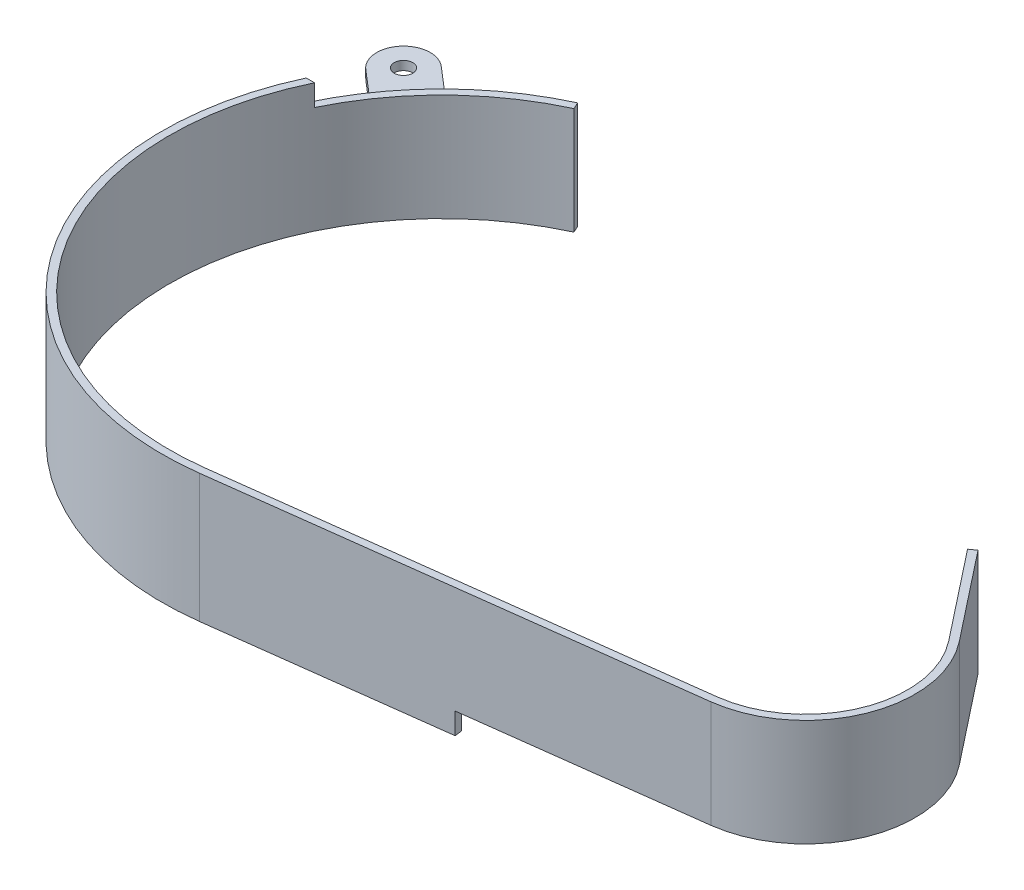
ISO-10303-21;
HEADER;
FILE_DESCRIPTION(('STEP AP214'),'2;1');
FILE_NAME('part.step','',(''),(''),'','','');
FILE_SCHEMA(('AUTOMOTIVE_DESIGN { 1 0 10303 214 1 1 1 1 }'));
ENDSEC;
DATA;
#1=APPLICATION_CONTEXT('core data for automotive mechanical design processes');
#2=APPLICATION_PROTOCOL_DEFINITION('international standard','automotive_design',2000,#1);
#3=PRODUCT_CONTEXT('',#1,'mechanical');
#4=PRODUCT('Part','Part','',(#3));
#5=PRODUCT_RELATED_PRODUCT_CATEGORY('part','',(#4));
#6=PRODUCT_DEFINITION_FORMATION('','',#4);
#7=PRODUCT_DEFINITION_CONTEXT('part definition',#1,'design');
#8=PRODUCT_DEFINITION('design','',#6,#7);
#9=PRODUCT_DEFINITION_SHAPE('','',#8);
#10=(LENGTH_UNIT() NAMED_UNIT(*) SI_UNIT(.MILLI.,.METRE.));
#11=(NAMED_UNIT(*) PLANE_ANGLE_UNIT() SI_UNIT($,.RADIAN.));
#12=(NAMED_UNIT(*) SI_UNIT($,.STERADIAN.) SOLID_ANGLE_UNIT());
#13=UNCERTAINTY_MEASURE_WITH_UNIT(LENGTH_MEASURE(1.E-05),#10,'distance_accuracy_value','');
#14=(GEOMETRIC_REPRESENTATION_CONTEXT(3) GLOBAL_UNCERTAINTY_ASSIGNED_CONTEXT((#13)) GLOBAL_UNIT_ASSIGNED_CONTEXT((#10,
#11,#12)) REPRESENTATION_CONTEXT('',''));
#15=CARTESIAN_POINT('',(0.,0.,0.));
#16=DIRECTION('',(0.,0.,1.));
#17=DIRECTION('',(1.,0.,0.));
#18=AXIS2_PLACEMENT_3D('',#15,#16,#17);
#19=CARTESIAN_POINT('',(-669.29,-38.1,84.2514773719377));
#20=DIRECTION('',(0.,1.,0.));
#21=DIRECTION('',(0.,0.,1.));
#22=AXIS2_PLACEMENT_3D('',#19,#20,#21);
#23=CYLINDRICAL_SURFACE('',#22,99.590128406925);
#24=DIRECTION('',(0.,1.,0.));
#25=VECTOR('',#24,1.);
#26=CARTESIAN_POINT('',(-759.552212425699,-7.62,42.1690976373533));
#27=LINE('',#26,#25);
#28=CARTESIAN_POINT('',(-759.552212425699,-7.62,42.1690976373533));
#29=VERTEX_POINT('',#28);
#30=CARTESIAN_POINT('',(-759.552212425699,0.,42.1690976373534));
#31=VERTEX_POINT('',#30);
#32=EDGE_CURVE('E252',#29,#31,#27,.T.);
#33=ORIENTED_EDGE('',*,*,#32,.F.);
#34=CARTESIAN_POINT('',(-669.29,-7.62,84.2514773719377));
#35=DIRECTION('',(0.,1.,0.));
#36=DIRECTION('',(0.,0.,-1.));
#37=AXIS2_PLACEMENT_3D('',#34,#35,#36);
#38=CIRCLE('',#37,99.5901284069251);
#39=CARTESIAN_POINT('',(-711.2,-7.62,-6.0909023626467));
#40=VERTEX_POINT('',#39);
#41=EDGE_CURVE('E247',#40,#29,#38,.T.);
#42=ORIENTED_EDGE('',*,*,#41,.F.);
#43=DIRECTION('',(0.,1.,0.));
#44=VECTOR('',#43,1.);
#45=CARTESIAN_POINT('',(-711.2,-38.1,-6.0909023626466));
#46=LINE('',#45,#44);
#47=CARTESIAN_POINT('',(-711.2,-45.72,-6.0909023626466));
#48=VERTEX_POINT('',#47);
#49=EDGE_CURVE('E312',#48,#40,#46,.T.);
#50=ORIENTED_EDGE('',*,*,#49,.F.);
#51=CARTESIAN_POINT('',(-669.29,-45.72,84.2514773719377));
#52=DIRECTION('',(0.,-1.,0.));
#53=DIRECTION('',(0.,0.,-1.));
#54=AXIS2_PLACEMENT_3D('',#51,#52,#53);
#55=CIRCLE('',#54,99.590128406925);
#56=CARTESIAN_POINT('',(-656.710129969068,-45.72,183.043888751115));
#57=VERTEX_POINT('',#56);
#58=EDGE_CURVE('E200',#57,#48,#55,.T.);
#59=ORIENTED_EDGE('',*,*,#58,.F.);
#60=DIRECTION('',(0.,1.,0.));
#61=VECTOR('',#60,1.);
#62=CARTESIAN_POINT('',(-656.710129969068,-38.1,183.043888751115));
#63=LINE('',#62,#61);
#64=CARTESIAN_POINT('',(-656.710129969068,0.,183.043888751115));
#65=VERTEX_POINT('',#64);
#66=EDGE_CURVE('E310',#57,#65,#63,.T.);
#67=ORIENTED_EDGE('',*,*,#66,.T.);
#68=CARTESIAN_POINT('',(-669.29,0.,84.2514773719377));
#69=DIRECTION('',(0.,1.,0.));
#70=DIRECTION('',(0.,0.,-1.));
#71=AXIS2_PLACEMENT_3D('',#68,#69,#70);
#72=CIRCLE('',#71,99.590128406925);
#73=EDGE_CURVE('E278',#31,#65,#72,.T.);
#74=ORIENTED_EDGE('',*,*,#73,.F.);
#75=EDGE_LOOP('',(#33,#42,#50,#59,#67,#74));
#76=FACE_BOUND('',#75,.T.);
#77=DIRECTION('',(0.,1.,0.));
#78=VECTOR('',#77,1.);
#79=CARTESIAN_POINT('',(-751.193944792643,-15.10675668,27.5951670127952));
#80=LINE('',#79,#78);
#81=CARTESIAN_POINT('',(-751.193944792643,-15.10675668,27.5951670127951));
#82=VERTEX_POINT('',#81);
#83=CARTESIAN_POINT('',(-751.193944792643,-11.93175668,27.5951670127951));
#84=VERTEX_POINT('',#83);
#85=EDGE_CURVE('E67',#82,#84,#80,.T.);
#86=ORIENTED_EDGE('',*,*,#85,.F.);
#87=CARTESIAN_POINT('',(-669.29,-15.10675668,84.2514773719377));
#88=DIRECTION('',(0.,1.,0.));
#89=DIRECTION('',(0.,0.,1.));
#90=AXIS2_PLACEMENT_3D('',#87,#88,#89);
#91=CIRCLE('',#90,99.590128406925);
#92=CARTESIAN_POINT('',(-738.912633033104,-15.10675668,13.0413471540705));
#93=VERTEX_POINT('',#92);
#94=EDGE_CURVE('E211',#82,#93,#91,.F.);
#95=ORIENTED_EDGE('',*,*,#94,.T.);
#96=DIRECTION('',(0.,1.,0.));
#97=VECTOR('',#96,1.);
#98=CARTESIAN_POINT('',(-738.912633033104,-15.10675668,13.0413471540706));
#99=LINE('',#98,#97);
#100=CARTESIAN_POINT('',(-738.912633033104,-11.93175668,13.0413471540706));
#101=VERTEX_POINT('',#100);
#102=EDGE_CURVE('E240',#93,#101,#99,.T.);
#103=ORIENTED_EDGE('',*,*,#102,.T.);
#104=CARTESIAN_POINT('',(-669.29,-11.93175668,84.2514773719377));
#105=DIRECTION('',(0.,1.,0.));
#106=DIRECTION('',(0.,0.,1.));
#107=AXIS2_PLACEMENT_3D('',#104,#105,#106);
#108=CIRCLE('',#107,99.590128406925);
#109=EDGE_CURVE('E224',#84,#101,#108,.F.);
#110=ORIENTED_EDGE('',*,*,#109,.F.);
#111=EDGE_LOOP('',(#86,#95,#103,#110));
#112=FACE_BOUND('',#111,.T.);
#113=ADVANCED_FACE('F42',(#76,#112),#23,.T.);
#114=CARTESIAN_POINT('',(-710.077660147768,-38.1,-3.6715548770441));
#115=DIRECTION('',(0.907141914361682,0.,-0.420824841481849));
#116=DIRECTION('',(-0.420824841481849,0.,-0.907141914361682));
#117=AXIS2_PLACEMENT_3D('',#114,#115,#116);
#118=PLANE('',#117);
#119=ORIENTED_EDGE('',*,*,#49,.T.);
#120=DIRECTION('',(-0.420824841481849,0.,-0.907141914361682));
#121=VECTOR('',#120,1.);
#122=CARTESIAN_POINT('',(-710.077660147768,-7.62,-3.6715548770441));
#123=LINE('',#122,#121);
#124=CARTESIAN_POINT('',(-710.077660147768,-7.62,-3.6715548770441));
#125=VERTEX_POINT('',#124);
#126=EDGE_CURVE('E245',#125,#40,#123,.T.);
#127=ORIENTED_EDGE('',*,*,#126,.F.);
#128=DIRECTION('',(0.,1.,0.));
#129=VECTOR('',#128,1.);
#130=CARTESIAN_POINT('',(-710.077660147768,-38.1,-3.6715548770441));
#131=LINE('',#130,#129);
#132=CARTESIAN_POINT('',(-710.077660147768,-45.72,-3.6715548770441));
#133=VERTEX_POINT('',#132);
#134=EDGE_CURVE('E46',#133,#125,#131,.T.);
#135=ORIENTED_EDGE('',*,*,#134,.F.);
#136=DIRECTION('',(0.420824841481863,0.,0.907141914361675));
#137=VECTOR('',#136,1.);
#138=CARTESIAN_POINT('',(-710.077660147768,-45.72,-3.6715548770441));
#139=LINE('',#138,#137);
#140=EDGE_CURVE('E192',#48,#133,#139,.T.);
#141=ORIENTED_EDGE('',*,*,#140,.F.);
#142=EDGE_LOOP('',(#119,#127,#135,#141));
#143=FACE_BOUND('',#142,.T.);
#144=ADVANCED_FACE('F317',(#143),#118,.T.);
#145=CARTESIAN_POINT('',(-669.29,-38.1,84.2514773719377));
#146=DIRECTION('',(0.,1.,0.));
#147=DIRECTION('',(0.,0.,1.));
#148=AXIS2_PLACEMENT_3D('',#145,#146,#147);
#149=CYLINDRICAL_SURFACE('',#148,96.9231284069251);
#150=DIRECTION('',(0.,1.,0.));
#151=VECTOR('',#150,1.);
#152=CARTESIAN_POINT('',(-756.600744677042,-7.62,42.1690976373534));
#153=LINE('',#152,#151);
#154=CARTESIAN_POINT('',(-756.600744677042,-7.62,42.1690976373534));
#155=VERTEX_POINT('',#154);
#156=CARTESIAN_POINT('',(-756.600744677042,0.,42.1690976373534));
#157=VERTEX_POINT('',#156);
#158=EDGE_CURVE('E254',#155,#157,#153,.T.);
#159=ORIENTED_EDGE('',*,*,#158,.T.);
#160=CARTESIAN_POINT('',(-669.29,0.,84.2514773719377));
#161=DIRECTION('',(0.,-1.,0.));
#162=DIRECTION('',(0.,0.,-1.));
#163=AXIS2_PLACEMENT_3D('',#160,#161,#162);
#164=CIRCLE('',#163,96.9231284069251);
#165=CARTESIAN_POINT('',(-657.047015902535,0.,180.398251423772));
#166=VERTEX_POINT('',#165);
#167=EDGE_CURVE('E175',#166,#157,#164,.T.);
#168=ORIENTED_EDGE('',*,*,#167,.F.);
#169=DIRECTION('',(0.,1.,0.));
#170=VECTOR('',#169,1.);
#171=CARTESIAN_POINT('',(-657.047015902535,-38.1,180.398251423772));
#172=LINE('',#171,#170);
#173=CARTESIAN_POINT('',(-657.047015902535,-45.72,180.398251423772));
#174=VERTEX_POINT('',#173);
#175=EDGE_CURVE('E12',#174,#166,#172,.T.);
#176=ORIENTED_EDGE('',*,*,#175,.F.);
#177=CARTESIAN_POINT('',(-669.29,-45.72,84.2514773719377));
#178=DIRECTION('',(0.,1.,0.));
#179=DIRECTION('',(0.,0.,-1.));
#180=AXIS2_PLACEMENT_3D('',#177,#178,#179);
#181=CIRCLE('',#180,96.9231284069251);
#182=EDGE_CURVE('E173',#133,#174,#181,.T.);
#183=ORIENTED_EDGE('',*,*,#182,.F.);
#184=ORIENTED_EDGE('',*,*,#134,.T.);
#185=CARTESIAN_POINT('',(-669.29,-7.62,84.2514773719377));
#186=DIRECTION('',(0.,-1.,0.));
#187=DIRECTION('',(0.,0.,1.));
#188=AXIS2_PLACEMENT_3D('',#185,#186,#187);
#189=CIRCLE('',#188,96.9231284069251);
#190=EDGE_CURVE('E243',#155,#125,#189,.T.);
#191=ORIENTED_EDGE('',*,*,#190,.F.);
#192=EDGE_LOOP('',(#159,#168,#176,#183,#184,#191));
#193=FACE_BOUND('',#192,.T.);
#194=ADVANCED_FACE('F44',(#193),#149,.F.);
#195=CARTESIAN_POINT('',(-657.047015902535,-38.1,180.398251423772));
#196=DIRECTION('',(-0.126316435495806,0.,-0.991989999003838));
#197=DIRECTION('',(-0.991989999003838,0.,0.126316435495806));
#198=AXIS2_PLACEMENT_3D('',#195,#196,#197);
#199=PLANE('',#198);
#200=DIRECTION('',(-0.991989999003838,0.,0.126316435495806));
#201=VECTOR('',#200,1.);
#202=CARTESIAN_POINT('',(-657.047015902535,0.,180.398251423772));
#203=LINE('',#202,#201);
#204=CARTESIAN_POINT('',(-495.540915966686,0.,159.832646049512));
#205=VERTEX_POINT('',#204);
#206=EDGE_CURVE('E260',#205,#166,#203,.T.);
#207=ORIENTED_EDGE('',*,*,#206,.F.);
#208=DIRECTION('',(0.,1.,0.));
#209=VECTOR('',#208,1.);
#210=CARTESIAN_POINT('',(-495.540915966686,-38.1,159.832646049512));
#211=LINE('',#210,#209);
#212=CARTESIAN_POINT('',(-495.540915966686,-38.1,159.832646049512));
#213=VERTEX_POINT('',#212);
#214=EDGE_CURVE('E51',#213,#205,#211,.T.);
#215=ORIENTED_EDGE('',*,*,#214,.F.);
#216=DIRECTION('',(-0.991989999003838,0.,0.126316435495806));
#217=VECTOR('',#216,1.);
#218=CARTESIAN_POINT('',(-657.047015902535,-38.1,180.398251423772));
#219=LINE('',#218,#217);
#220=CARTESIAN_POINT('',(-576.29396593461,-38.1,170.115448736642));
#221=VERTEX_POINT('',#220);
#222=EDGE_CURVE('E275',#213,#221,#219,.T.);
#223=ORIENTED_EDGE('',*,*,#222,.T.);
#224=DIRECTION('',(0.,1.,0.));
#225=VECTOR('',#224,1.);
#226=CARTESIAN_POINT('',(-576.29396593461,-45.72,170.115448736642));
#227=LINE('',#226,#225);
#228=CARTESIAN_POINT('',(-576.29396593461,-45.72,170.115448736642));
#229=VERTEX_POINT('',#228);
#230=EDGE_CURVE('E183',#229,#221,#227,.T.);
#231=ORIENTED_EDGE('',*,*,#230,.F.);
#232=DIRECTION('',(0.991989999003838,0.,-0.126316435495806));
#233=VECTOR('',#232,1.);
#234=CARTESIAN_POINT('',(-657.047015902535,-45.72,180.398251423772));
#235=LINE('',#234,#233);
#236=EDGE_CURVE('E180',#174,#229,#235,.T.);
#237=ORIENTED_EDGE('',*,*,#236,.F.);
#238=ORIENTED_EDGE('',*,*,#175,.T.);
#239=EDGE_LOOP('',(#207,#215,#223,#231,#237,#238));
#240=FACE_BOUND('',#239,.T.);
#241=ADVANCED_FACE('F181',(#240),#199,.T.);
#242=CARTESIAN_POINT('',(-500.126000000001,-38.1,123.824999951937));
#243=DIRECTION('',(0.,1.,0.));
#244=DIRECTION('',(0.,0.,1.));
#245=AXIS2_PLACEMENT_3D('',#242,#243,#244);
#246=CYLINDRICAL_SURFACE('',#245,36.2983962880004);
#247=CARTESIAN_POINT('',(-500.126000000001,0.,123.824999951937));
#248=DIRECTION('',(0.,-1.,0.));
#249=DIRECTION('',(0.,0.,1.));
#250=AXIS2_PLACEMENT_3D('',#247,#248,#249);
#251=CIRCLE('',#250,36.2983962880004);
#252=CARTESIAN_POINT('',(-471.62152618742,0.,101.351269826552));
#253=VERTEX_POINT('',#252);
#254=EDGE_CURVE('E295',#253,#205,#251,.T.);
#255=ORIENTED_EDGE('',*,*,#254,.F.);
#256=DIRECTION('',(0.,1.,0.));
#257=VECTOR('',#256,1.);
#258=CARTESIAN_POINT('',(-471.62152618742,-38.1,101.351269826552));
#259=LINE('',#258,#257);
#260=CARTESIAN_POINT('',(-471.62152618742,-38.1,101.351269826552));
#261=VERTEX_POINT('',#260);
#262=EDGE_CURVE('E300',#261,#253,#259,.T.);
#263=ORIENTED_EDGE('',*,*,#262,.F.);
#264=CARTESIAN_POINT('',(-500.126000000001,-38.1,123.824999951937));
#265=DIRECTION('',(0.,-1.,0.));
#266=DIRECTION('',(0.,0.,1.));
#267=AXIS2_PLACEMENT_3D('',#264,#265,#266);
#268=CIRCLE('',#267,36.2983962880004);
#269=EDGE_CURVE('E272',#261,#213,#268,.T.);
#270=ORIENTED_EDGE('',*,*,#269,.T.);
#271=ORIENTED_EDGE('',*,*,#214,.T.);
#272=EDGE_LOOP('',(#255,#263,#270,#271));
#273=FACE_BOUND('',#272,.T.);
#274=ADVANCED_FACE('F334',(#273),#246,.F.);
#275=CARTESIAN_POINT('',(-471.62152618742,-38.1,101.351269826553));
#276=DIRECTION('',(-0.785281905746435,0.,0.61913837589609));
#277=DIRECTION('',(0.61913837589609,0.,0.785281905746435));
#278=AXIS2_PLACEMENT_3D('',#275,#276,#277);
#279=PLANE('',#278);
#280=DIRECTION('',(0.61913837589609,0.,0.785281905746434));
#281=VECTOR('',#280,1.);
#282=CARTESIAN_POINT('',(-471.62152618742,0.,101.351269826553));
#283=LINE('',#282,#281);
#284=CARTESIAN_POINT('',(-496.558145125506,0.,69.7229999519377));
#285=VERTEX_POINT('',#284);
#286=EDGE_CURVE('E292',#285,#253,#283,.T.);
#287=ORIENTED_EDGE('',*,*,#286,.F.);
#288=DIRECTION('',(0.,1.,0.));
#289=VECTOR('',#288,1.);
#290=CARTESIAN_POINT('',(-496.558145125506,-38.1,69.7229999519377));
#291=LINE('',#290,#289);
#292=CARTESIAN_POINT('',(-496.558145125506,-38.1,69.7229999519377));
#293=VERTEX_POINT('',#292);
#294=EDGE_CURVE('E302',#293,#285,#291,.T.);
#295=ORIENTED_EDGE('',*,*,#294,.F.);
#296=DIRECTION('',(0.61913837589609,0.,0.785281905746434));
#297=VECTOR('',#296,1.);
#298=CARTESIAN_POINT('',(-471.62152618742,-38.1,101.351269826553));
#299=LINE('',#298,#297);
#300=EDGE_CURVE('E269',#293,#261,#299,.T.);
#301=ORIENTED_EDGE('',*,*,#300,.T.);
#302=ORIENTED_EDGE('',*,*,#262,.T.);
#303=EDGE_LOOP('',(#287,#295,#301,#302));
#304=FACE_BOUND('',#303,.T.);
#305=ADVANCED_FACE('F365',(#304),#279,.T.);
#306=CARTESIAN_POINT('',(-496.558145125506,-38.1,69.7229999519377));
#307=DIRECTION('',(-0.570376861955664,0.,-0.821383123363032));
#308=DIRECTION('',(-0.821383123363032,0.,0.570376861955664));
#309=AXIS2_PLACEMENT_3D('',#306,#307,#308);
#310=PLANE('',#309);
#311=DIRECTION('',(-0.821383123363032,0.,0.570376861955663));
#312=VECTOR('',#311,1.);
#313=CARTESIAN_POINT('',(-496.558145125506,0.,69.7229999519377));
#314=LINE('',#313,#312);
#315=CARTESIAN_POINT('',(-494.36347706742,0.,68.1989999519377));
#316=VERTEX_POINT('',#315);
#317=EDGE_CURVE('E289',#316,#285,#314,.T.);
#318=ORIENTED_EDGE('',*,*,#317,.F.);
#319=DIRECTION('',(0.,1.,0.));
#320=VECTOR('',#319,1.);
#321=CARTESIAN_POINT('',(-494.36347706742,-38.1,68.1989999519377));
#322=LINE('',#321,#320);
#323=CARTESIAN_POINT('',(-494.36347706742,-38.1,68.1989999519377));
#324=VERTEX_POINT('',#323);
#325=EDGE_CURVE('E304',#324,#316,#322,.T.);
#326=ORIENTED_EDGE('',*,*,#325,.F.);
#327=DIRECTION('',(-0.821383123363032,0.,0.570376861955663));
#328=VECTOR('',#327,1.);
#329=CARTESIAN_POINT('',(-496.558145125506,-38.1,69.7229999519377));
#330=LINE('',#329,#328);
#331=EDGE_CURVE('E266',#324,#293,#330,.T.);
#332=ORIENTED_EDGE('',*,*,#331,.T.);
#333=ORIENTED_EDGE('',*,*,#294,.T.);
#334=EDGE_LOOP('',(#318,#326,#332,#333));
#335=FACE_BOUND('',#334,.T.);
#336=ADVANCED_FACE('F361',(#335),#310,.T.);
#337=CARTESIAN_POINT('',(-469.527179344794,-38.1,99.7000277780376));
#338=DIRECTION('',(0.785281905746433,0.,-0.619138375896092));
#339=DIRECTION('',(-0.619138375896092,0.,-0.785281905746433));
#340=AXIS2_PLACEMENT_3D('',#337,#338,#339);
#341=PLANE('',#340);
#342=DIRECTION('',(-0.619138375896092,0.,-0.785281905746433));
#343=VECTOR('',#342,1.);
#344=CARTESIAN_POINT('',(-469.527179344794,0.,99.7000277780376));
#345=LINE('',#344,#343);
#346=CARTESIAN_POINT('',(-469.527179344794,0.,99.7000277780376));
#347=VERTEX_POINT('',#346);
#348=EDGE_CURVE('E286',#347,#316,#345,.T.);
#349=ORIENTED_EDGE('',*,*,#348,.F.);
#350=DIRECTION('',(0.,1.,0.));
#351=VECTOR('',#350,1.);
#352=CARTESIAN_POINT('',(-469.527179344794,-38.1,99.7000277780376));
#353=LINE('',#352,#351);
#354=CARTESIAN_POINT('',(-469.527179344794,-38.1,99.7000277780376));
#355=VERTEX_POINT('',#354);
#356=EDGE_CURVE('E306',#355,#347,#353,.T.);
#357=ORIENTED_EDGE('',*,*,#356,.F.);
#358=DIRECTION('',(-0.619138375896092,0.,-0.785281905746433));
#359=VECTOR('',#358,1.);
#360=CARTESIAN_POINT('',(-469.527179344794,-38.1,99.7000277780376));
#361=LINE('',#360,#359);
#362=EDGE_CURVE('E263',#355,#324,#361,.T.);
#363=ORIENTED_EDGE('',*,*,#362,.T.);
#364=ORIENTED_EDGE('',*,*,#325,.T.);
#365=EDGE_LOOP('',(#349,#357,#363,#364));
#366=FACE_BOUND('',#365,.T.);
#367=ADVANCED_FACE('F357',(#366),#341,.T.);
#368=CARTESIAN_POINT('',(-500.126,-38.1,123.824999951938));
#369=DIRECTION('',(0.,1.,0.));
#370=DIRECTION('',(0.,0.,1.));
#371=AXIS2_PLACEMENT_3D('',#368,#369,#370);
#372=CYLINDRICAL_SURFACE('',#371,38.9653962880001);
#373=CARTESIAN_POINT('',(-500.126,0.,123.824999951938));
#374=DIRECTION('',(0.,1.,0.));
#375=DIRECTION('',(0.,0.,-1.));
#376=AXIS2_PLACEMENT_3D('',#373,#374,#375);
#377=CIRCLE('',#376,38.9653962880001);
#378=CARTESIAN_POINT('',(-495.204030033218,0.,162.478283376855));
#379=VERTEX_POINT('',#378);
#380=EDGE_CURVE('E283',#379,#347,#377,.T.);
#381=ORIENTED_EDGE('',*,*,#380,.F.);
#382=DIRECTION('',(0.,1.,0.));
#383=VECTOR('',#382,1.);
#384=CARTESIAN_POINT('',(-495.204030033218,-38.1,162.478283376855));
#385=LINE('',#384,#383);
#386=CARTESIAN_POINT('',(-495.204030033218,-38.1,162.478283376855));
#387=VERTEX_POINT('',#386);
#388=EDGE_CURVE('E308',#387,#379,#385,.T.);
#389=ORIENTED_EDGE('',*,*,#388,.F.);
#390=CARTESIAN_POINT('',(-500.126,-38.1,123.824999951938));
#391=DIRECTION('',(0.,1.,0.));
#392=DIRECTION('',(0.,0.,-1.));
#393=AXIS2_PLACEMENT_3D('',#390,#391,#392);
#394=CIRCLE('',#393,38.9653962880001);
#395=EDGE_CURVE('E259',#387,#355,#394,.T.);
#396=ORIENTED_EDGE('',*,*,#395,.T.);
#397=ORIENTED_EDGE('',*,*,#356,.T.);
#398=EDGE_LOOP('',(#381,#389,#396,#397));
#399=FACE_BOUND('',#398,.T.);
#400=ADVANCED_FACE('F345',(#399),#372,.T.);
#401=CARTESIAN_POINT('',(-656.710129969068,-38.1,183.043888751115));
#402=DIRECTION('',(0.126316435495805,0.,0.991989999003838));
#403=DIRECTION('',(0.991989999003838,0.,-0.126316435495805));
#404=AXIS2_PLACEMENT_3D('',#401,#402,#403);
#405=PLANE('',#404);
#406=DIRECTION('',(0.991989999003838,0.,-0.126316435495805));
#407=VECTOR('',#406,1.);
#408=CARTESIAN_POINT('',(-656.710129969068,0.,183.043888751115));
#409=LINE('',#408,#407);
#410=EDGE_CURVE('E280',#65,#379,#409,.T.);
#411=ORIENTED_EDGE('',*,*,#410,.F.);
#412=ORIENTED_EDGE('',*,*,#66,.F.);
#413=DIRECTION('',(-0.991989999003838,0.,0.126316435495805));
#414=VECTOR('',#413,1.);
#415=CARTESIAN_POINT('',(-656.710129969068,-45.72,183.043888751115));
#416=LINE('',#415,#414);
#417=CARTESIAN_POINT('',(-575.957080001143,-45.72,172.761086063985));
#418=VERTEX_POINT('',#417);
#419=EDGE_CURVE('E197',#418,#57,#416,.T.);
#420=ORIENTED_EDGE('',*,*,#419,.F.);
#421=DIRECTION('',(0.,1.,0.));
#422=VECTOR('',#421,1.);
#423=CARTESIAN_POINT('',(-575.957080001143,-45.72,172.761086063985));
#424=LINE('',#423,#422);
#425=CARTESIAN_POINT('',(-575.957080001143,-38.1,172.761086063985));
#426=VERTEX_POINT('',#425);
#427=EDGE_CURVE('E202',#418,#426,#424,.T.);
#428=ORIENTED_EDGE('',*,*,#427,.T.);
#429=DIRECTION('',(0.991989999003838,0.,-0.126316435495805));
#430=VECTOR('',#429,1.);
#431=CARTESIAN_POINT('',(-656.710129969068,-38.1,183.043888751115));
#432=LINE('',#431,#430);
#433=EDGE_CURVE('E257',#426,#387,#432,.T.);
#434=ORIENTED_EDGE('',*,*,#433,.T.);
#435=ORIENTED_EDGE('',*,*,#388,.T.);
#436=EDGE_LOOP('',(#411,#412,#420,#428,#434,#435));
#437=FACE_BOUND('',#436,.T.);
#438=ADVANCED_FACE('F338',(#437),#405,.T.);
#439=CARTESIAN_POINT('',(-669.29,-38.1,84.2514773719377));
#440=DIRECTION('',(0.,-1.,0.));
#441=DIRECTION('',(0.,0.,-1.));
#442=AXIS2_PLACEMENT_3D('',#439,#440,#441);
#443=PLANE('',#442);
#444=DIRECTION('',(0.126316435495788,0.,0.99198999900384));
#445=VECTOR('',#444,1.);
#446=CARTESIAN_POINT('',(-575.957080001143,-38.1,172.761086063985));
#447=LINE('',#446,#445);
#448=EDGE_CURVE('E59',#221,#426,#447,.T.);
#449=ORIENTED_EDGE('',*,*,#448,.F.);
#450=ORIENTED_EDGE('',*,*,#222,.F.);
#451=ORIENTED_EDGE('',*,*,#269,.F.);
#452=ORIENTED_EDGE('',*,*,#300,.F.);
#453=ORIENTED_EDGE('',*,*,#331,.F.);
#454=ORIENTED_EDGE('',*,*,#362,.F.);
#455=ORIENTED_EDGE('',*,*,#395,.F.);
#456=ORIENTED_EDGE('',*,*,#433,.F.);
#457=EDGE_LOOP('',(#449,#450,#451,#452,#453,#454,#455,#456));
#458=FACE_BOUND('',#457,.T.);
#459=ADVANCED_FACE('F336',(#458),#443,.T.);
#460=CARTESIAN_POINT('',(-669.29,0.,84.2514773719377));
#461=DIRECTION('',(0.,-1.,0.));
#462=DIRECTION('',(0.,0.,-1.));
#463=AXIS2_PLACEMENT_3D('',#460,#461,#462);
#464=PLANE('',#463);
#465=ORIENTED_EDGE('',*,*,#167,.T.);
#466=DIRECTION('',(1.,0.,0.));
#467=VECTOR('',#466,1.);
#468=CARTESIAN_POINT('',(-756.600744677042,0.,42.1690976373534));
#469=LINE('',#468,#467);
#470=EDGE_CURVE('E236',#31,#157,#469,.T.);
#471=ORIENTED_EDGE('',*,*,#470,.F.);
#472=ORIENTED_EDGE('',*,*,#73,.T.);
#473=ORIENTED_EDGE('',*,*,#410,.T.);
#474=ORIENTED_EDGE('',*,*,#380,.T.);
#475=ORIENTED_EDGE('',*,*,#348,.T.);
#476=ORIENTED_EDGE('',*,*,#317,.T.);
#477=ORIENTED_EDGE('',*,*,#286,.T.);
#478=ORIENTED_EDGE('',*,*,#254,.T.);
#479=ORIENTED_EDGE('',*,*,#206,.T.);
#480=EDGE_LOOP('',(#465,#471,#472,#473,#474,#475,#476,#477,#478,#479));
#481=FACE_BOUND('',#480,.T.);
#482=ADVANCED_FACE('F330',(#481),#464,.F.);
#483=CARTESIAN_POINT('',(-756.600744677042,-7.62,42.1690976373534));
#484=DIRECTION('',(0.,0.,1.));
#485=DIRECTION('',(1.,0.,0.));
#486=AXIS2_PLACEMENT_3D('',#483,#484,#485);
#487=PLANE('',#486);
#488=ORIENTED_EDGE('',*,*,#470,.T.);
#489=ORIENTED_EDGE('',*,*,#158,.F.);
#490=DIRECTION('',(1.,0.,0.));
#491=VECTOR('',#490,1.);
#492=CARTESIAN_POINT('',(-756.600744677042,-7.62,42.1690976373534));
#493=LINE('',#492,#491);
#494=EDGE_CURVE('E249',#29,#155,#493,.T.);
#495=ORIENTED_EDGE('',*,*,#494,.F.);
#496=ORIENTED_EDGE('',*,*,#32,.T.);
#497=EDGE_LOOP('',(#488,#489,#495,#496));
#498=FACE_BOUND('',#497,.T.);
#499=ADVANCED_FACE('F328',(#498),#487,.F.);
#500=CARTESIAN_POINT('',(-669.29,-7.62,84.2514773719377));
#501=DIRECTION('',(0.,1.,0.));
#502=DIRECTION('',(0.,0.,1.));
#503=AXIS2_PLACEMENT_3D('',#500,#501,#502);
#504=PLANE('',#503);
#505=ORIENTED_EDGE('',*,*,#190,.T.);
#506=ORIENTED_EDGE('',*,*,#126,.T.);
#507=ORIENTED_EDGE('',*,*,#41,.T.);
#508=ORIENTED_EDGE('',*,*,#494,.T.);
#509=EDGE_LOOP('',(#505,#506,#507,#508));
#510=FACE_BOUND('',#509,.T.);
#511=ADVANCED_FACE('F320',(#510),#504,.T.);
#512=CARTESIAN_POINT('',(-332.282068789321,-15.10675668,387.143640281363));
#513=DIRECTION('',(-0.651293663705703,0.,0.758825779488811));
#514=DIRECTION('',(0.758825779488811,0.,0.651293663705703));
#515=AXIS2_PLACEMENT_3D('',#512,#513,#514);
#516=PLANE('',#515);
#517=DIRECTION('',(0.758825779488812,0.,0.651293663705703));
#518=VECTOR('',#517,1.);
#519=CARTESIAN_POINT('',(-332.282068789321,-11.93175668,387.143640281363));
#520=LINE('',#519,#518);
#521=CARTESIAN_POINT('',(-763.481160966797,-11.93175668,17.0491546669843));
#522=VERTEX_POINT('',#521);
#523=EDGE_CURVE('E207',#522,#84,#520,.T.);
#524=ORIENTED_EDGE('',*,*,#523,.F.);
#525=DIRECTION('',(0.,1.,0.));
#526=VECTOR('',#525,1.);
#527=CARTESIAN_POINT('',(-763.481160966797,-15.10675668,17.0491546669843));
#528=LINE('',#527,#526);
#529=CARTESIAN_POINT('',(-763.481160966797,-15.10675668,17.0491546669843));
#530=VERTEX_POINT('',#529);
#531=EDGE_CURVE('E234',#530,#522,#528,.T.);
#532=ORIENTED_EDGE('',*,*,#531,.F.);
#533=DIRECTION('',(0.758825779488812,0.,0.651293663705703));
#534=VECTOR('',#533,1.);
#535=CARTESIAN_POINT('',(-332.282068789321,-15.10675668,387.143640281363));
#536=LINE('',#535,#534);
#537=EDGE_CURVE('E208',#530,#82,#536,.T.);
#538=ORIENTED_EDGE('',*,*,#537,.T.);
#539=ORIENTED_EDGE('',*,*,#85,.T.);
#540=EDGE_LOOP('',(#524,#532,#538,#539));
#541=FACE_BOUND('',#540,.T.);
#542=ADVANCED_FACE('F440',(#541),#516,.T.);
#543=CARTESIAN_POINT('',(-757.27758882,-15.10675668,9.82133911735338));
#544=DIRECTION('',(0.,1.,0.));
#545=DIRECTION('',(0.,0.,1.));
#546=AXIS2_PLACEMENT_3D('',#543,#544,#545);
#547=CYLINDRICAL_SURFACE('',#546,9.52500000000003);
#548=CARTESIAN_POINT('',(-757.27758882,-11.93175668,9.82133911735338));
#549=DIRECTION('',(0.,1.,0.));
#550=DIRECTION('',(0.,0.,1.));
#551=AXIS2_PLACEMENT_3D('',#548,#549,#550);
#552=CIRCLE('',#551,9.52500000000003);
#553=CARTESIAN_POINT('',(-751.074016673201,-11.93175668,2.59352356772408));
#554=VERTEX_POINT('',#553);
#555=EDGE_CURVE('E230',#522,#554,#552,.F.);
#556=ORIENTED_EDGE('',*,*,#555,.T.);
#557=DIRECTION('',(0.,1.,0.));
#558=VECTOR('',#557,1.);
#559=CARTESIAN_POINT('',(-751.074016673201,-15.10675668,2.59352356772408));
#560=LINE('',#559,#558);
#561=CARTESIAN_POINT('',(-751.074016673201,-15.10675668,2.59352356772408));
#562=VERTEX_POINT('',#561);
#563=EDGE_CURVE('E237',#562,#554,#560,.T.);
#564=ORIENTED_EDGE('',*,*,#563,.F.);
#565=CARTESIAN_POINT('',(-757.27758882,-15.10675668,9.82133911735338));
#566=DIRECTION('',(0.,1.,0.));
#567=DIRECTION('',(0.,0.,1.));
#568=AXIS2_PLACEMENT_3D('',#565,#566,#567);
#569=CIRCLE('',#568,9.52500000000003);
#570=EDGE_CURVE('E217',#530,#562,#569,.F.);
#571=ORIENTED_EDGE('',*,*,#570,.F.);
#572=ORIENTED_EDGE('',*,*,#531,.T.);
#573=EDGE_LOOP('',(#556,#564,#571,#572));
#574=FACE_BOUND('',#573,.T.);
#575=ADVANCED_FACE('F430',(#574),#547,.T.);
#576=CARTESIAN_POINT('',(-320.219899292076,-15.10675668,372.739548318322));
#577=DIRECTION('',(-0.65164599485572,0.,0.758523234573932));
#578=DIRECTION('',(0.758523234573932,0.,0.65164599485572));
#579=AXIS2_PLACEMENT_3D('',#576,#577,#578);
#580=PLANE('',#579);
#581=DIRECTION('',(0.758523234573932,0.,0.65164599485572));
#582=VECTOR('',#581,1.);
#583=CARTESIAN_POINT('',(-320.219899292076,-11.93175668,372.739548318322));
#584=LINE('',#583,#582);
#585=EDGE_CURVE('E227',#554,#101,#584,.T.);
#586=ORIENTED_EDGE('',*,*,#585,.T.);
#587=ORIENTED_EDGE('',*,*,#102,.F.);
#588=DIRECTION('',(0.758523234573932,0.,0.65164599485572));
#589=VECTOR('',#588,1.);
#590=CARTESIAN_POINT('',(-320.219899292076,-15.10675668,372.739548318322));
#591=LINE('',#590,#589);
#592=EDGE_CURVE('E214',#562,#93,#591,.T.);
#593=ORIENTED_EDGE('',*,*,#592,.F.);
#594=ORIENTED_EDGE('',*,*,#563,.T.);
#595=EDGE_LOOP('',(#586,#587,#593,#594));
#596=FACE_BOUND('',#595,.T.);
#597=ADVANCED_FACE('F420',(#596),#580,.F.);
#598=CARTESIAN_POINT('',(-757.27758882,-15.10675668,9.82133911735338));
#599=DIRECTION('',(0.,1.,0.));
#600=DIRECTION('',(0.,0.,1.));
#601=AXIS2_PLACEMENT_3D('',#598,#599,#600);
#602=CYLINDRICAL_SURFACE('',#601,3.29999999999998);
#603=CARTESIAN_POINT('',(-757.27758882,-15.10675668,9.82133911735338));
#604=DIRECTION('',(0.,1.,0.));
#605=DIRECTION('',(0.,0.,1.));
#606=AXIS2_PLACEMENT_3D('',#603,#604,#605);
#607=CIRCLE('',#606,3.29999999999998);
#608=CARTESIAN_POINT('',(-757.27758882,-15.10675668,13.1213391173534));
#609=VERTEX_POINT('',#608);
#610=EDGE_CURVE('E219',#609,#609,#607,.T.);
#611=ORIENTED_EDGE('',*,*,#610,.F.);
#612=EDGE_LOOP('',(#611));
#613=FACE_BOUND('',#612,.T.);
#614=CARTESIAN_POINT('',(-757.27758882,-11.93175668,9.82133911735338));
#615=DIRECTION('',(0.,1.,0.));
#616=DIRECTION('',(0.,0.,1.));
#617=AXIS2_PLACEMENT_3D('',#614,#615,#616);
#618=CIRCLE('',#617,3.29999999999998);
#619=CARTESIAN_POINT('',(-757.27758882,-11.93175668,13.1213391173534));
#620=VERTEX_POINT('',#619);
#621=EDGE_CURVE('E212',#620,#620,#618,.T.);
#622=ORIENTED_EDGE('',*,*,#621,.T.);
#623=EDGE_LOOP('',(#622));
#624=FACE_BOUND('',#623,.T.);
#625=ADVANCED_FACE('F410',(#613,#624),#602,.F.);
#626=CARTESIAN_POINT('',(0.,-15.10675668,0.));
#627=DIRECTION('',(0.,1.,0.));
#628=DIRECTION('',(0.,0.,1.));
#629=AXIS2_PLACEMENT_3D('',#626,#627,#628);
#630=PLANE('',#629);
#631=ORIENTED_EDGE('',*,*,#537,.F.);
#632=ORIENTED_EDGE('',*,*,#570,.T.);
#633=ORIENTED_EDGE('',*,*,#592,.T.);
#634=ORIENTED_EDGE('',*,*,#94,.F.);
#635=EDGE_LOOP('',(#631,#632,#633,#634));
#636=FACE_BOUND('',#635,.T.);
#637=ORIENTED_EDGE('',*,*,#610,.T.);
#638=EDGE_LOOP('',(#637));
#639=FACE_BOUND('',#638,.T.);
#640=ADVANCED_FACE('F399',(#636,#639),#630,.F.);
#641=CARTESIAN_POINT('',(0.,-11.93175668,0.));
#642=DIRECTION('',(0.,1.,0.));
#643=DIRECTION('',(0.,0.,1.));
#644=AXIS2_PLACEMENT_3D('',#641,#642,#643);
#645=PLANE('',#644);
#646=ORIENTED_EDGE('',*,*,#523,.T.);
#647=ORIENTED_EDGE('',*,*,#109,.T.);
#648=ORIENTED_EDGE('',*,*,#585,.F.);
#649=ORIENTED_EDGE('',*,*,#555,.F.);
#650=EDGE_LOOP('',(#646,#647,#648,#649));
#651=FACE_BOUND('',#650,.T.);
#652=ORIENTED_EDGE('',*,*,#621,.F.);
#653=EDGE_LOOP('',(#652));
#654=FACE_BOUND('',#653,.T.);
#655=ADVANCED_FACE('F394',(#651,#654),#645,.T.);
#656=CARTESIAN_POINT('',(-575.957080001143,-45.72,172.761086063985));
#657=DIRECTION('',(-0.99198999900384,0.,0.126316435495788));
#658=DIRECTION('',(0.126316435495788,0.,0.99198999900384));
#659=AXIS2_PLACEMENT_3D('',#656,#657,#658);
#660=PLANE('',#659);
#661=ORIENTED_EDGE('',*,*,#448,.T.);
#662=ORIENTED_EDGE('',*,*,#427,.F.);
#663=DIRECTION('',(0.126316435495788,0.,0.99198999900384));
#664=VECTOR('',#663,1.);
#665=CARTESIAN_POINT('',(-575.957080001143,-45.72,172.761086063985));
#666=LINE('',#665,#664);
#667=EDGE_CURVE('E186',#229,#418,#666,.T.);
#668=ORIENTED_EDGE('',*,*,#667,.F.);
#669=ORIENTED_EDGE('',*,*,#230,.T.);
#670=EDGE_LOOP('',(#661,#662,#668,#669));
#671=FACE_BOUND('',#670,.T.);
#672=ADVANCED_FACE('F398',(#671),#660,.F.);
#673=CARTESIAN_POINT('',(-669.29,-45.72,84.2514773719377));
#674=DIRECTION('',(0.,-1.,0.));
#675=DIRECTION('',(0.,0.,-1.));
#676=AXIS2_PLACEMENT_3D('',#673,#674,#675);
#677=PLANE('',#676);
#678=ORIENTED_EDGE('',*,*,#182,.T.);
#679=ORIENTED_EDGE('',*,*,#236,.T.);
#680=ORIENTED_EDGE('',*,*,#667,.T.);
#681=ORIENTED_EDGE('',*,*,#419,.T.);
#682=ORIENTED_EDGE('',*,*,#58,.T.);
#683=ORIENTED_EDGE('',*,*,#140,.T.);
#684=EDGE_LOOP('',(#678,#679,#680,#681,#682,#683));
#685=FACE_BOUND('',#684,.T.);
#686=ADVANCED_FACE('F189',(#685),#677,.T.);
#687=CLOSED_SHELL('',(#113,#144,#194,#241,#274,#305,#336,#367,#400,#438,#459,#482,#499,#511,
#542,#575,#597,#625,#640,#655,#672,#686));
#688=MANIFOLD_SOLID_BREP('B2',#687);
#689=ADVANCED_BREP_SHAPE_REPRESENTATION('',(#18,#688),#14);
#690=SHAPE_DEFINITION_REPRESENTATION(#9,#689);
ENDSEC;
END-ISO-10303-21;
